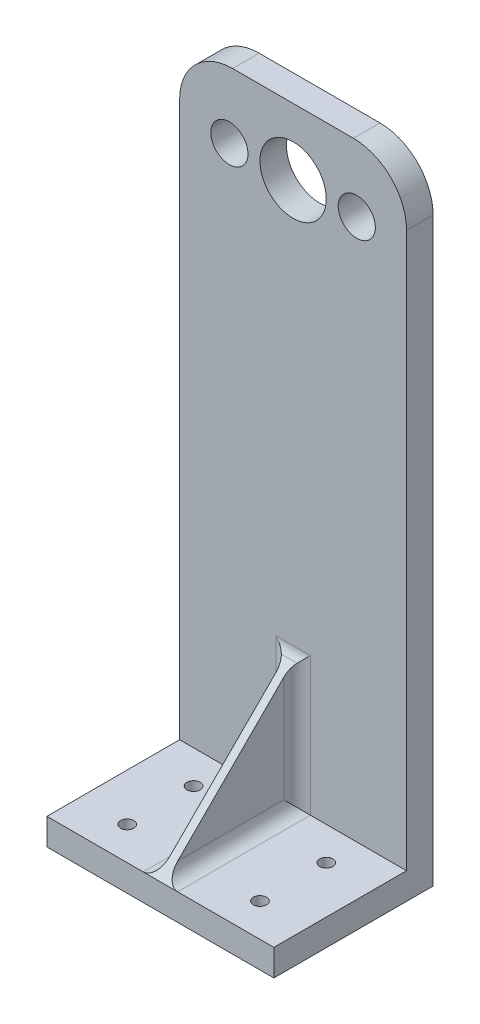
ISO-10303-21;
HEADER;
FILE_DESCRIPTION(('STEP AP214'),'2;1');
FILE_NAME('part.step','',(''),(''),'','','');
FILE_SCHEMA(('AUTOMOTIVE_DESIGN { 1 0 10303 214 1 1 1 1 }'));
ENDSEC;
DATA;
#1=APPLICATION_CONTEXT('core data for automotive mechanical design processes');
#2=APPLICATION_PROTOCOL_DEFINITION('international standard','automotive_design',2000,#1);
#3=PRODUCT_CONTEXT('',#1,'mechanical');
#4=PRODUCT('Part','Part','',(#3));
#5=PRODUCT_RELATED_PRODUCT_CATEGORY('part','',(#4));
#6=PRODUCT_DEFINITION_FORMATION('','',#4);
#7=PRODUCT_DEFINITION_CONTEXT('part definition',#1,'design');
#8=PRODUCT_DEFINITION('design','',#6,#7);
#9=PRODUCT_DEFINITION_SHAPE('','',#8);
#10=(LENGTH_UNIT() NAMED_UNIT(*) SI_UNIT(.MILLI.,.METRE.));
#11=(NAMED_UNIT(*) PLANE_ANGLE_UNIT() SI_UNIT($,.RADIAN.));
#12=(NAMED_UNIT(*) SI_UNIT($,.STERADIAN.) SOLID_ANGLE_UNIT());
#13=UNCERTAINTY_MEASURE_WITH_UNIT(LENGTH_MEASURE(1.E-05),#10,'distance_accuracy_value','');
#14=(GEOMETRIC_REPRESENTATION_CONTEXT(3) GLOBAL_UNCERTAINTY_ASSIGNED_CONTEXT((#13)) GLOBAL_UNIT_ASSIGNED_CONTEXT((#10,
#11,#12)) REPRESENTATION_CONTEXT('',''));
#15=CARTESIAN_POINT('',(0.,0.,0.));
#16=DIRECTION('',(0.,0.,1.));
#17=DIRECTION('',(1.,0.,0.));
#18=AXIS2_PLACEMENT_3D('',#15,#16,#17);
#19=CARTESIAN_POINT('',(-10.8585,-51.816,15.24));
#20=DIRECTION('',(0.,-1.,0.));
#21=DIRECTION('',(0.,0.,-1.));
#22=AXIS2_PLACEMENT_3D('',#19,#20,#21);
#23=PLANE('',#22);
#24=CARTESIAN_POINT('',(-6.34999999999999,-51.816,12.065));
#25=DIRECTION('',(0.,1.,0.));
#26=DIRECTION('',(0.,0.,1.));
#27=AXIS2_PLACEMENT_3D('',#24,#25,#26);
#28=CIRCLE('',#27,0.635000000000001);
#29=CARTESIAN_POINT('',(-6.34999999999999,-51.816,12.7));
#30=VERTEX_POINT('',#29);
#31=EDGE_CURVE('E225',#30,#30,#28,.T.);
#32=ORIENTED_EDGE('',*,*,#31,.F.);
#33=EDGE_LOOP('',(#32));
#34=FACE_BOUND('',#33,.T.);
#35=CARTESIAN_POINT('',(-6.34999999999999,-51.816,5.715));
#36=DIRECTION('',(0.,1.,0.));
#37=DIRECTION('',(0.,0.,1.));
#38=AXIS2_PLACEMENT_3D('',#35,#36,#37);
#39=CIRCLE('',#38,0.635000000000001);
#40=CARTESIAN_POINT('',(-6.34999999999999,-51.816,6.35));
#41=VERTEX_POINT('',#40);
#42=EDGE_CURVE('E248',#41,#41,#39,.T.);
#43=ORIENTED_EDGE('',*,*,#42,.F.);
#44=EDGE_LOOP('',(#43));
#45=FACE_BOUND('',#44,.T.);
#46=DIRECTION('',(-1.,0.,0.));
#47=VECTOR('',#46,1.);
#48=CARTESIAN_POINT('',(-10.8585,-51.816,15.24));
#49=LINE('',#48,#47);
#50=CARTESIAN_POINT('',(-1.651,-51.816,15.24));
#51=VERTEX_POINT('',#50);
#52=CARTESIAN_POINT('',(-10.8585,-51.816,15.24));
#53=VERTEX_POINT('',#52);
#54=EDGE_CURVE('E160',#51,#53,#49,.T.);
#55=ORIENTED_EDGE('',*,*,#54,.F.);
#56=DIRECTION('',(0.,0.,1.));
#57=VECTOR('',#56,1.);
#58=CARTESIAN_POINT('',(-1.65099999999999,-51.816,2.54));
#59=LINE('',#58,#57);
#60=CARTESIAN_POINT('',(-1.651,-51.816,2.54));
#61=VERTEX_POINT('',#60);
#62=EDGE_CURVE('E201',#51,#61,#59,.F.);
#63=ORIENTED_EDGE('',*,*,#62,.T.);
#64=DIRECTION('',(-1.,0.,0.));
#65=VECTOR('',#64,1.);
#66=CARTESIAN_POINT('',(-10.8585,-51.816,2.54));
#67=LINE('',#66,#65);
#68=CARTESIAN_POINT('',(-10.8585,-51.816,2.54));
#69=VERTEX_POINT('',#68);
#70=EDGE_CURVE('E165',#61,#69,#67,.T.);
#71=ORIENTED_EDGE('',*,*,#70,.T.);
#72=DIRECTION('',(0.,0.,-1.));
#73=VECTOR('',#72,1.);
#74=CARTESIAN_POINT('',(-10.8585,-51.816,15.24));
#75=LINE('',#74,#73);
#76=EDGE_CURVE('E173',#53,#69,#75,.T.);
#77=ORIENTED_EDGE('',*,*,#76,.F.);
#78=EDGE_LOOP('',(#55,#63,#71,#77));
#79=FACE_BOUND('',#78,.T.);
#80=ADVANCED_FACE('F33',(#34,#45,#79),#23,.F.);
#81=CARTESIAN_POINT('',(0.,0.,2.54));
#82=DIRECTION('',(0.,0.,1.));
#83=DIRECTION('',(1.,0.,0.));
#84=AXIS2_PLACEMENT_3D('',#81,#82,#83);
#85=PLANE('',#84);
#86=DIRECTION('',(-1.,0.,0.));
#87=VECTOR('',#86,1.);
#88=CARTESIAN_POINT('',(0.381000000000005,-38.5899487757862,2.54));
#89=LINE('',#88,#87);
#90=CARTESIAN_POINT('',(-1.65099999999999,-38.5899487757862,2.54));
#91=VERTEX_POINT('',#90);
#92=CARTESIAN_POINT('',(1.65100000000001,-38.5899487757862,2.54));
#93=VERTEX_POINT('',#92);
#94=EDGE_CURVE('E186',#91,#93,#89,.F.);
#95=ORIENTED_EDGE('',*,*,#94,.T.);
#96=DIRECTION('',(0.,-1.,0.));
#97=VECTOR('',#96,1.);
#98=CARTESIAN_POINT('',(1.65100000000001,-51.816,2.54));
#99=LINE('',#98,#97);
#100=CARTESIAN_POINT('',(1.651,-51.816,2.54));
#101=VERTEX_POINT('',#100);
#102=EDGE_CURVE('E190',#93,#101,#99,.T.);
#103=ORIENTED_EDGE('',*,*,#102,.T.);
#104=CARTESIAN_POINT('',(10.8585,-51.816,2.54));
#105=VERTEX_POINT('',#104);
#106=EDGE_CURVE('E162',#105,#101,#67,.T.);
#107=ORIENTED_EDGE('',*,*,#106,.F.);
#108=DIRECTION('',(0.,1.,0.));
#109=VECTOR('',#108,1.);
#110=CARTESIAN_POINT('',(10.8585,6.35,2.54));
#111=LINE('',#110,#109);
#112=CARTESIAN_POINT('',(10.8585,1.27,2.54));
#113=VERTEX_POINT('',#112);
#114=EDGE_CURVE('E389',#105,#113,#111,.T.);
#115=ORIENTED_EDGE('',*,*,#114,.T.);
#116=CARTESIAN_POINT('',(5.7785,1.27,2.54));
#117=DIRECTION('',(0.,0.,1.));
#118=DIRECTION('',(1.,0.,0.));
#119=AXIS2_PLACEMENT_3D('',#116,#117,#118);
#120=CIRCLE('',#119,5.08);
#121=CARTESIAN_POINT('',(5.77849999999999,6.35,2.54));
#122=VERTEX_POINT('',#121);
#123=EDGE_CURVE('E624',#113,#122,#120,.T.);
#124=ORIENTED_EDGE('',*,*,#123,.T.);
#125=DIRECTION('',(-1.,0.,0.));
#126=VECTOR('',#125,1.);
#127=CARTESIAN_POINT('',(-10.8585,6.35,2.54));
#128=LINE('',#127,#126);
#129=CARTESIAN_POINT('',(-5.7785,6.35,2.54));
#130=VERTEX_POINT('',#129);
#131=EDGE_CURVE('E398',#122,#130,#128,.T.);
#132=ORIENTED_EDGE('',*,*,#131,.T.);
#133=CARTESIAN_POINT('',(-5.7785,1.27,2.54));
#134=DIRECTION('',(0.,0.,1.));
#135=DIRECTION('',(1.,0.,0.));
#136=AXIS2_PLACEMENT_3D('',#133,#134,#135);
#137=CIRCLE('',#136,5.08);
#138=CARTESIAN_POINT('',(-10.8585,1.27,2.54));
#139=VERTEX_POINT('',#138);
#140=EDGE_CURVE('E385',#130,#139,#137,.T.);
#141=ORIENTED_EDGE('',*,*,#140,.T.);
#142=DIRECTION('',(0.,-1.,0.));
#143=VECTOR('',#142,1.);
#144=CARTESIAN_POINT('',(-10.8585,6.35,2.54));
#145=LINE('',#144,#143);
#146=EDGE_CURVE('E386',#139,#69,#145,.T.);
#147=ORIENTED_EDGE('',*,*,#146,.T.);
#148=ORIENTED_EDGE('',*,*,#70,.F.);
#149=DIRECTION('',(0.,-1.,0.));
#150=VECTOR('',#149,1.);
#151=CARTESIAN_POINT('',(-1.651,0.,2.54));
#152=LINE('',#151,#150);
#153=EDGE_CURVE('E188',#61,#91,#152,.F.);
#154=ORIENTED_EDGE('',*,*,#153,.T.);
#155=EDGE_LOOP('',(#95,#103,#107,#115,#124,#132,#141,#147,#148,#154));
#156=FACE_BOUND('',#155,.T.);
#157=CARTESIAN_POINT('',(6.096,0.,2.54));
#158=DIRECTION('',(0.,0.,1.));
#159=DIRECTION('',(1.,0.,0.));
#160=AXIS2_PLACEMENT_3D('',#157,#158,#159);
#161=CIRCLE('',#160,1.778);
#162=CARTESIAN_POINT('',(7.874,0.,2.54));
#163=VERTEX_POINT('',#162);
#164=EDGE_CURVE('E414',#163,#163,#161,.T.);
#165=ORIENTED_EDGE('',*,*,#164,.F.);
#166=EDGE_LOOP('',(#165));
#167=FACE_BOUND('',#166,.T.);
#168=CARTESIAN_POINT('',(0.,0.,2.54));
#169=DIRECTION('',(0.,0.,1.));
#170=DIRECTION('',(1.,0.,0.));
#171=AXIS2_PLACEMENT_3D('',#168,#169,#170);
#172=CIRCLE('',#171,3.175);
#173=CARTESIAN_POINT('',(3.175,0.,2.54));
#174=VERTEX_POINT('',#173);
#175=EDGE_CURVE('E409',#174,#174,#172,.T.);
#176=ORIENTED_EDGE('',*,*,#175,.F.);
#177=EDGE_LOOP('',(#176));
#178=FACE_BOUND('',#177,.T.);
#179=CARTESIAN_POINT('',(-6.096,0.,2.54));
#180=DIRECTION('',(0.,0.,1.));
#181=DIRECTION('',(1.,0.,0.));
#182=AXIS2_PLACEMENT_3D('',#179,#180,#181);
#183=CIRCLE('',#182,1.778);
#184=CARTESIAN_POINT('',(-4.318,0.,2.54));
#185=VERTEX_POINT('',#184);
#186=EDGE_CURVE('E176',#185,#185,#183,.T.);
#187=ORIENTED_EDGE('',*,*,#186,.F.);
#188=EDGE_LOOP('',(#187));
#189=FACE_BOUND('',#188,.T.);
#190=ADVANCED_FACE('F302',(#156,#167,#178,#189),#85,.T.);
#191=CARTESIAN_POINT('',(0.,0.,0.));
#192=DIRECTION('',(0.,0.,1.));
#193=DIRECTION('',(1.,0.,0.));
#194=AXIS2_PLACEMENT_3D('',#191,#192,#193);
#195=PLANE('',#194);
#196=CARTESIAN_POINT('',(6.096,0.,0.));
#197=DIRECTION('',(0.,0.,1.));
#198=DIRECTION('',(1.,0.,0.));
#199=AXIS2_PLACEMENT_3D('',#196,#197,#198);
#200=CIRCLE('',#199,1.778);
#201=CARTESIAN_POINT('',(7.874,0.,0.));
#202=VERTEX_POINT('',#201);
#203=EDGE_CURVE('E416',#202,#202,#200,.T.);
#204=ORIENTED_EDGE('',*,*,#203,.T.);
#205=EDGE_LOOP('',(#204));
#206=FACE_BOUND('',#205,.T.);
#207=DIRECTION('',(-1.,0.,0.));
#208=VECTOR('',#207,1.);
#209=CARTESIAN_POINT('',(-10.8585,6.35,0.));
#210=LINE('',#209,#208);
#211=CARTESIAN_POINT('',(5.77849999999999,6.35,0.));
#212=VERTEX_POINT('',#211);
#213=CARTESIAN_POINT('',(-5.7785,6.35,0.));
#214=VERTEX_POINT('',#213);
#215=EDGE_CURVE('E390',#212,#214,#210,.T.);
#216=ORIENTED_EDGE('',*,*,#215,.F.);
#217=CARTESIAN_POINT('',(5.7785,1.27,0.));
#218=DIRECTION('',(0.,0.,1.));
#219=DIRECTION('',(1.,0.,0.));
#220=AXIS2_PLACEMENT_3D('',#217,#218,#219);
#221=CIRCLE('',#220,5.08);
#222=CARTESIAN_POINT('',(10.8585,1.27,0.));
#223=VERTEX_POINT('',#222);
#224=EDGE_CURVE('E381',#212,#223,#221,.F.);
#225=ORIENTED_EDGE('',*,*,#224,.T.);
#226=DIRECTION('',(0.,1.,0.));
#227=VECTOR('',#226,1.);
#228=CARTESIAN_POINT('',(10.8585,6.35,0.));
#229=LINE('',#228,#227);
#230=CARTESIAN_POINT('',(10.8585,-54.356,0.));
#231=VERTEX_POINT('',#230);
#232=EDGE_CURVE('E405',#231,#223,#229,.T.);
#233=ORIENTED_EDGE('',*,*,#232,.F.);
#234=DIRECTION('',(1.,0.,0.));
#235=VECTOR('',#234,1.);
#236=CARTESIAN_POINT('',(-10.8585,-54.356,0.));
#237=LINE('',#236,#235);
#238=CARTESIAN_POINT('',(-10.8585,-54.356,0.));
#239=VERTEX_POINT('',#238);
#240=EDGE_CURVE('E408',#239,#231,#237,.T.);
#241=ORIENTED_EDGE('',*,*,#240,.F.);
#242=DIRECTION('',(0.,-1.,0.));
#243=VECTOR('',#242,1.);
#244=CARTESIAN_POINT('',(-10.8585,6.35,0.));
#245=LINE('',#244,#243);
#246=CARTESIAN_POINT('',(-10.8585,1.27,0.));
#247=VERTEX_POINT('',#246);
#248=EDGE_CURVE('E146',#247,#239,#245,.T.);
#249=ORIENTED_EDGE('',*,*,#248,.F.);
#250=CARTESIAN_POINT('',(-5.7785,1.27,0.));
#251=DIRECTION('',(0.,0.,1.));
#252=DIRECTION('',(1.,0.,0.));
#253=AXIS2_PLACEMENT_3D('',#250,#251,#252);
#254=CIRCLE('',#253,5.08);
#255=EDGE_CURVE('E379',#247,#214,#254,.F.);
#256=ORIENTED_EDGE('',*,*,#255,.T.);
#257=EDGE_LOOP('',(#216,#225,#233,#241,#249,#256));
#258=FACE_BOUND('',#257,.T.);
#259=CARTESIAN_POINT('',(0.,0.,0.));
#260=DIRECTION('',(0.,0.,1.));
#261=DIRECTION('',(1.,0.,0.));
#262=AXIS2_PLACEMENT_3D('',#259,#260,#261);
#263=CIRCLE('',#262,3.175);
#264=CARTESIAN_POINT('',(3.175,0.,0.));
#265=VERTEX_POINT('',#264);
#266=EDGE_CURVE('E394',#265,#265,#263,.T.);
#267=ORIENTED_EDGE('',*,*,#266,.T.);
#268=EDGE_LOOP('',(#267));
#269=FACE_BOUND('',#268,.T.);
#270=CARTESIAN_POINT('',(-6.096,0.,0.));
#271=DIRECTION('',(0.,0.,1.));
#272=DIRECTION('',(1.,0.,0.));
#273=AXIS2_PLACEMENT_3D('',#270,#271,#272);
#274=CIRCLE('',#273,1.778);
#275=CARTESIAN_POINT('',(-4.318,0.,0.));
#276=VERTEX_POINT('',#275);
#277=EDGE_CURVE('E368',#276,#276,#274,.T.);
#278=ORIENTED_EDGE('',*,*,#277,.T.);
#279=EDGE_LOOP('',(#278));
#280=FACE_BOUND('',#279,.T.);
#281=ADVANCED_FACE('F308',(#206,#258,#269,#280),#195,.F.);
#282=CARTESIAN_POINT('',(-10.8585,6.35,2.54));
#283=DIRECTION('',(1.,0.,0.));
#284=DIRECTION('',(0.,1.,0.));
#285=AXIS2_PLACEMENT_3D('',#282,#283,#284);
#286=PLANE('',#285);
#287=ORIENTED_EDGE('',*,*,#146,.F.);
#288=DIRECTION('',(0.,0.,-1.));
#289=VECTOR('',#288,1.);
#290=CARTESIAN_POINT('',(-10.8585,1.27,2.54));
#291=LINE('',#290,#289);
#292=EDGE_CURVE('E184',#139,#247,#291,.T.);
#293=ORIENTED_EDGE('',*,*,#292,.T.);
#294=ORIENTED_EDGE('',*,*,#248,.T.);
#295=DIRECTION('',(0.,0.,-1.));
#296=VECTOR('',#295,1.);
#297=CARTESIAN_POINT('',(-10.8585,-54.356,2.54));
#298=LINE('',#297,#296);
#299=CARTESIAN_POINT('',(-10.8585,-54.356,15.24));
#300=VERTEX_POINT('',#299);
#301=EDGE_CURVE('E137',#300,#239,#298,.T.);
#302=ORIENTED_EDGE('',*,*,#301,.F.);
#303=DIRECTION('',(0.,-1.,0.));
#304=VECTOR('',#303,1.);
#305=CARTESIAN_POINT('',(-10.8585,-54.356,15.24));
#306=LINE('',#305,#304);
#307=EDGE_CURVE('E143',#53,#300,#306,.T.);
#308=ORIENTED_EDGE('',*,*,#307,.F.);
#309=ORIENTED_EDGE('',*,*,#76,.T.);
#310=EDGE_LOOP('',(#287,#293,#294,#302,#308,#309));
#311=FACE_BOUND('',#310,.T.);
#312=ADVANCED_FACE('F140',(#311),#286,.F.);
#313=CARTESIAN_POINT('',(-10.8585,-54.356,2.54));
#314=DIRECTION('',(0.,1.,0.));
#315=DIRECTION('',(0.,0.,1.));
#316=AXIS2_PLACEMENT_3D('',#313,#314,#315);
#317=PLANE('',#316);
#318=CARTESIAN_POINT('',(-6.34999999999999,-54.356,12.065));
#319=DIRECTION('',(0.,1.,0.));
#320=DIRECTION('',(0.,0.,1.));
#321=AXIS2_PLACEMENT_3D('',#318,#319,#320);
#322=CIRCLE('',#321,0.635000000000001);
#323=CARTESIAN_POINT('',(-6.34999999999999,-54.356,12.7));
#324=VERTEX_POINT('',#323);
#325=EDGE_CURVE('E231',#324,#324,#322,.T.);
#326=ORIENTED_EDGE('',*,*,#325,.T.);
#327=EDGE_LOOP('',(#326));
#328=FACE_BOUND('',#327,.T.);
#329=CARTESIAN_POINT('',(6.35,-54.356,12.065));
#330=DIRECTION('',(0.,1.,0.));
#331=DIRECTION('',(0.,0.,1.));
#332=AXIS2_PLACEMENT_3D('',#329,#330,#331);
#333=CIRCLE('',#332,0.635000000000001);
#334=CARTESIAN_POINT('',(6.35,-54.356,12.7));
#335=VERTEX_POINT('',#334);
#336=EDGE_CURVE('E239',#335,#335,#333,.T.);
#337=ORIENTED_EDGE('',*,*,#336,.T.);
#338=EDGE_LOOP('',(#337));
#339=FACE_BOUND('',#338,.T.);
#340=CARTESIAN_POINT('',(6.35,-54.356,5.715));
#341=DIRECTION('',(0.,1.,0.));
#342=DIRECTION('',(0.,0.,1.));
#343=AXIS2_PLACEMENT_3D('',#340,#341,#342);
#344=CIRCLE('',#343,0.635000000000001);
#345=CARTESIAN_POINT('',(6.35,-54.356,6.35));
#346=VERTEX_POINT('',#345);
#347=EDGE_CURVE('E245',#346,#346,#344,.T.);
#348=ORIENTED_EDGE('',*,*,#347,.T.);
#349=EDGE_LOOP('',(#348));
#350=FACE_BOUND('',#349,.T.);
#351=CARTESIAN_POINT('',(-6.34999999999999,-54.356,5.715));
#352=DIRECTION('',(0.,1.,0.));
#353=DIRECTION('',(0.,0.,1.));
#354=AXIS2_PLACEMENT_3D('',#351,#352,#353);
#355=CIRCLE('',#354,0.635000000000001);
#356=CARTESIAN_POINT('',(-6.34999999999999,-54.356,6.35));
#357=VERTEX_POINT('',#356);
#358=EDGE_CURVE('E251',#357,#357,#355,.T.);
#359=ORIENTED_EDGE('',*,*,#358,.T.);
#360=EDGE_LOOP('',(#359));
#361=FACE_BOUND('',#360,.T.);
#362=ORIENTED_EDGE('',*,*,#240,.T.);
#363=DIRECTION('',(0.,0.,-1.));
#364=VECTOR('',#363,1.);
#365=CARTESIAN_POINT('',(10.8585,-54.356,2.54));
#366=LINE('',#365,#364);
#367=CARTESIAN_POINT('',(10.8585,-54.356,15.24));
#368=VERTEX_POINT('',#367);
#369=EDGE_CURVE('E150',#368,#231,#366,.T.);
#370=ORIENTED_EDGE('',*,*,#369,.F.);
#371=DIRECTION('',(1.,0.,0.));
#372=VECTOR('',#371,1.);
#373=CARTESIAN_POINT('',(-10.8585,-54.356,15.24));
#374=LINE('',#373,#372);
#375=EDGE_CURVE('E153',#300,#368,#374,.T.);
#376=ORIENTED_EDGE('',*,*,#375,.F.);
#377=ORIENTED_EDGE('',*,*,#301,.T.);
#378=EDGE_LOOP('',(#362,#370,#376,#377));
#379=FACE_BOUND('',#378,.T.);
#380=ADVANCED_FACE('F154',(#328,#339,#350,#361,#379),#317,.F.);
#381=CARTESIAN_POINT('',(10.8585,6.35,2.54));
#382=DIRECTION('',(-1.,0.,0.));
#383=DIRECTION('',(0.,-1.,0.));
#384=AXIS2_PLACEMENT_3D('',#381,#382,#383);
#385=PLANE('',#384);
#386=ORIENTED_EDGE('',*,*,#232,.T.);
#387=DIRECTION('',(0.,0.,-1.));
#388=VECTOR('',#387,1.);
#389=CARTESIAN_POINT('',(10.8585,1.27,2.54));
#390=LINE('',#389,#388);
#391=EDGE_CURVE('E383',#223,#113,#390,.F.);
#392=ORIENTED_EDGE('',*,*,#391,.T.);
#393=ORIENTED_EDGE('',*,*,#114,.F.);
#394=DIRECTION('',(0.,0.,-1.));
#395=VECTOR('',#394,1.);
#396=CARTESIAN_POINT('',(10.8585,-51.816,15.24));
#397=LINE('',#396,#395);
#398=CARTESIAN_POINT('',(10.8585,-51.816,15.24));
#399=VERTEX_POINT('',#398);
#400=EDGE_CURVE('E367',#399,#105,#397,.T.);
#401=ORIENTED_EDGE('',*,*,#400,.F.);
#402=DIRECTION('',(0.,1.,0.));
#403=VECTOR('',#402,1.);
#404=CARTESIAN_POINT('',(10.8585,-54.356,15.24));
#405=LINE('',#404,#403);
#406=EDGE_CURVE('E157',#368,#399,#405,.T.);
#407=ORIENTED_EDGE('',*,*,#406,.F.);
#408=ORIENTED_EDGE('',*,*,#369,.T.);
#409=EDGE_LOOP('',(#386,#392,#393,#401,#407,#408));
#410=FACE_BOUND('',#409,.T.);
#411=ADVANCED_FACE('F356',(#410),#385,.F.);
#412=CARTESIAN_POINT('',(-10.8585,6.35,2.54));
#413=DIRECTION('',(0.,-1.,0.));
#414=DIRECTION('',(1.,0.,0.));
#415=AXIS2_PLACEMENT_3D('',#412,#413,#414);
#416=PLANE('',#415);
#417=ORIENTED_EDGE('',*,*,#131,.F.);
#418=DIRECTION('',(0.,0.,-1.));
#419=VECTOR('',#418,1.);
#420=CARTESIAN_POINT('',(5.7785,6.35,2.54));
#421=LINE('',#420,#419);
#422=EDGE_CURVE('E376',#122,#212,#421,.T.);
#423=ORIENTED_EDGE('',*,*,#422,.T.);
#424=ORIENTED_EDGE('',*,*,#215,.T.);
#425=DIRECTION('',(0.,0.,-1.));
#426=VECTOR('',#425,1.);
#427=CARTESIAN_POINT('',(-5.7785,6.35,2.54));
#428=LINE('',#427,#426);
#429=EDGE_CURVE('E149',#214,#130,#428,.F.);
#430=ORIENTED_EDGE('',*,*,#429,.T.);
#431=EDGE_LOOP('',(#417,#423,#424,#430));
#432=FACE_BOUND('',#431,.T.);
#433=ADVANCED_FACE('F437',(#432),#416,.F.);
#434=CARTESIAN_POINT('',(0.,0.,2.54));
#435=DIRECTION('',(0.,0.,-1.));
#436=DIRECTION('',(-1.,0.,0.));
#437=AXIS2_PLACEMENT_3D('',#434,#435,#436);
#438=CYLINDRICAL_SURFACE('',#437,3.175);
#439=ORIENTED_EDGE('',*,*,#175,.T.);
#440=EDGE_LOOP('',(#439));
#441=FACE_BOUND('',#440,.T.);
#442=ORIENTED_EDGE('',*,*,#266,.F.);
#443=EDGE_LOOP('',(#442));
#444=FACE_BOUND('',#443,.T.);
#445=ADVANCED_FACE('F440',(#441,#444),#438,.F.);
#446=CARTESIAN_POINT('',(6.096,0.,2.54));
#447=DIRECTION('',(0.,0.,-1.));
#448=DIRECTION('',(-1.,0.,0.));
#449=AXIS2_PLACEMENT_3D('',#446,#447,#448);
#450=CYLINDRICAL_SURFACE('',#449,1.778);
#451=ORIENTED_EDGE('',*,*,#164,.T.);
#452=EDGE_LOOP('',(#451));
#453=FACE_BOUND('',#452,.T.);
#454=ORIENTED_EDGE('',*,*,#203,.F.);
#455=EDGE_LOOP('',(#454));
#456=FACE_BOUND('',#455,.T.);
#457=ADVANCED_FACE('F321',(#453,#456),#450,.F.);
#458=CARTESIAN_POINT('',(-6.096,0.,2.54));
#459=DIRECTION('',(0.,0.,-1.));
#460=DIRECTION('',(-1.,0.,0.));
#461=AXIS2_PLACEMENT_3D('',#458,#459,#460);
#462=CYLINDRICAL_SURFACE('',#461,1.778);
#463=ORIENTED_EDGE('',*,*,#186,.T.);
#464=EDGE_LOOP('',(#463));
#465=FACE_BOUND('',#464,.T.);
#466=ORIENTED_EDGE('',*,*,#277,.F.);
#467=EDGE_LOOP('',(#466));
#468=FACE_BOUND('',#467,.T.);
#469=ADVANCED_FACE('F315',(#465,#468),#462,.F.);
#470=CARTESIAN_POINT('',(6.35,-51.816,12.065));
#471=DIRECTION('',(0.,1.,0.));
#472=DIRECTION('',(0.,0.,1.));
#473=AXIS2_PLACEMENT_3D('',#470,#471,#472);
#474=CIRCLE('',#473,0.635000000000001);
#475=CARTESIAN_POINT('',(6.35,-51.816,12.7));
#476=VERTEX_POINT('',#475);
#477=EDGE_CURVE('E236',#476,#476,#474,.T.);
#478=ORIENTED_EDGE('',*,*,#477,.F.);
#479=EDGE_LOOP('',(#478));
#480=FACE_BOUND('',#479,.T.);
#481=CARTESIAN_POINT('',(6.35,-51.816,5.715));
#482=DIRECTION('',(0.,1.,0.));
#483=DIRECTION('',(0.,0.,1.));
#484=AXIS2_PLACEMENT_3D('',#481,#482,#483);
#485=CIRCLE('',#484,0.635000000000001);
#486=CARTESIAN_POINT('',(6.35,-51.816,6.35));
#487=VERTEX_POINT('',#486);
#488=EDGE_CURVE('E242',#487,#487,#485,.T.);
#489=ORIENTED_EDGE('',*,*,#488,.F.);
#490=EDGE_LOOP('',(#489));
#491=FACE_BOUND('',#490,.T.);
#492=ORIENTED_EDGE('',*,*,#106,.T.);
#493=DIRECTION('',(0.,0.,1.));
#494=VECTOR('',#493,1.);
#495=CARTESIAN_POINT('',(1.65100000000001,-51.816,15.24));
#496=LINE('',#495,#494);
#497=CARTESIAN_POINT('',(1.65100000000001,-51.816,15.24));
#498=VERTEX_POINT('',#497);
#499=EDGE_CURVE('E203',#101,#498,#496,.T.);
#500=ORIENTED_EDGE('',*,*,#499,.T.);
#501=EDGE_CURVE('E171',#399,#498,#49,.T.);
#502=ORIENTED_EDGE('',*,*,#501,.F.);
#503=ORIENTED_EDGE('',*,*,#400,.T.);
#504=EDGE_LOOP('',(#492,#500,#502,#503));
#505=FACE_BOUND('',#504,.T.);
#506=ADVANCED_FACE('F286',(#480,#491,#505),#23,.F.);
#507=CARTESIAN_POINT('',(0.,0.,15.24));
#508=DIRECTION('',(0.,0.,-1.));
#509=DIRECTION('',(-1.,0.,0.));
#510=AXIS2_PLACEMENT_3D('',#507,#508,#509);
#511=PLANE('',#510);
#512=ORIENTED_EDGE('',*,*,#307,.T.);
#513=ORIENTED_EDGE('',*,*,#375,.T.);
#514=ORIENTED_EDGE('',*,*,#406,.T.);
#515=ORIENTED_EDGE('',*,*,#501,.T.);
#516=DIRECTION('',(-1.,0.,0.));
#517=VECTOR('',#516,1.);
#518=CARTESIAN_POINT('',(0.381000000000007,-51.816,15.24));
#519=LINE('',#518,#517);
#520=EDGE_CURVE('E51',#498,#51,#519,.T.);
#521=ORIENTED_EDGE('',*,*,#520,.T.);
#522=ORIENTED_EDGE('',*,*,#54,.T.);
#523=EDGE_LOOP('',(#512,#513,#514,#515,#521,#522));
#524=FACE_BOUND('',#523,.T.);
#525=ADVANCED_FACE('F159',(#524),#511,.F.);
#526=CARTESIAN_POINT('',(0.381000000000005,-39.116,2.54));
#527=DIRECTION('',(0.,0.707106781186547,0.707106781186548));
#528=DIRECTION('',(0.,-0.707106781186548,0.707106781186547));
#529=AXIS2_PLACEMENT_3D('',#526,#527,#528);
#530=PLANE('',#529);
#531=CARTESIAN_POINT('',(1.65100000000001,-40.386,3.81));
#532=DIRECTION('',(0.,0.707106781186547,0.707106781186548));
#533=DIRECTION('',(0.,0.707106781186548,-0.707106781186547));
#534=AXIS2_PLACEMENT_3D('',#531,#532,#533);
#535=ELLIPSE('',#534,1.79605122421383,1.27);
#536=CARTESIAN_POINT('',(0.381000000000006,-40.386,3.81));
#537=VERTEX_POINT('',#536);
#538=CARTESIAN_POINT('',(0.752974387893092,-39.4879743878931,2.91197438789308));
#539=VERTEX_POINT('',#538);
#540=EDGE_CURVE('E208',#537,#539,#535,.F.);
#541=ORIENTED_EDGE('',*,*,#540,.T.);
#542=DIRECTION('',(-1.,0.,0.));
#543=VECTOR('',#542,1.);
#544=CARTESIAN_POINT('',(-0.380999999999995,-39.4879743878931,2.91197438789308));
#545=LINE('',#544,#543);
#546=CARTESIAN_POINT('',(-0.752974387893081,-39.4879743878931,2.91197438789308));
#547=VERTEX_POINT('',#546);
#548=EDGE_CURVE('E206',#539,#547,#545,.T.);
#549=ORIENTED_EDGE('',*,*,#548,.T.);
#550=CARTESIAN_POINT('',(-1.65099999999999,-40.386,3.81));
#551=DIRECTION('',(0.,0.707106781186547,0.707106781186548));
#552=DIRECTION('',(0.,-0.707106781186548,0.707106781186547));
#553=AXIS2_PLACEMENT_3D('',#550,#551,#552);
#554=ELLIPSE('',#553,1.79605122421383,1.27);
#555=CARTESIAN_POINT('',(-0.380999999999994,-40.386,3.81));
#556=VERTEX_POINT('',#555);
#557=EDGE_CURVE('E211',#547,#556,#554,.F.);
#558=ORIENTED_EDGE('',*,*,#557,.T.);
#559=DIRECTION('',(0.,0.707106781186548,-0.707106781186547));
#560=VECTOR('',#559,1.);
#561=CARTESIAN_POINT('',(-0.380999999999995,-39.116,2.54));
#562=LINE('',#561,#560);
#563=CARTESIAN_POINT('',(-0.380999999999993,-50.546,13.97));
#564=VERTEX_POINT('',#563);
#565=EDGE_CURVE('E254',#564,#556,#562,.T.);
#566=ORIENTED_EDGE('',*,*,#565,.F.);
#567=CARTESIAN_POINT('',(-1.65099999999999,-50.546,13.97));
#568=DIRECTION('',(0.,0.707106781186547,0.707106781186548));
#569=DIRECTION('',(0.,0.707106781186548,-0.707106781186547));
#570=AXIS2_PLACEMENT_3D('',#567,#568,#569);
#571=ELLIPSE('',#570,1.79605122421383,1.27);
#572=EDGE_CURVE('E43',#564,#51,#571,.F.);
#573=ORIENTED_EDGE('',*,*,#572,.T.);
#574=ORIENTED_EDGE('',*,*,#520,.F.);
#575=CARTESIAN_POINT('',(1.65100000000001,-50.546,13.97));
#576=DIRECTION('',(0.,0.707106781186547,0.707106781186548));
#577=DIRECTION('',(0.,-0.707106781186548,0.707106781186547));
#578=AXIS2_PLACEMENT_3D('',#575,#576,#577);
#579=ELLIPSE('',#578,1.79605122421383,1.27);
#580=CARTESIAN_POINT('',(0.381000000000007,-50.546,13.97));
#581=VERTEX_POINT('',#580);
#582=EDGE_CURVE('E11',#498,#581,#579,.F.);
#583=ORIENTED_EDGE('',*,*,#582,.T.);
#584=DIRECTION('',(0.,0.707106781186548,-0.707106781186547));
#585=VECTOR('',#584,1.);
#586=CARTESIAN_POINT('',(0.381000000000005,-39.116,2.54));
#587=LINE('',#586,#585);
#588=EDGE_CURVE('E258',#581,#537,#587,.T.);
#589=ORIENTED_EDGE('',*,*,#588,.T.);
#590=EDGE_LOOP('',(#541,#549,#558,#566,#573,#574,#583,#589));
#591=FACE_BOUND('',#590,.T.);
#592=ADVANCED_FACE('F263',(#591),#530,.T.);
#593=CARTESIAN_POINT('',(0.381,0.,0.));
#594=DIRECTION('',(1.,0.,0.));
#595=DIRECTION('',(0.,1.,0.));
#596=AXIS2_PLACEMENT_3D('',#593,#594,#595);
#597=PLANE('',#596);
#598=DIRECTION('',(0.,0.,1.));
#599=VECTOR('',#598,1.);
#600=CARTESIAN_POINT('',(0.381000000000007,-50.546,0.));
#601=LINE('',#600,#599);
#602=CARTESIAN_POINT('',(0.381000000000007,-50.546,3.81));
#603=VERTEX_POINT('',#602);
#604=EDGE_CURVE('E193',#581,#603,#601,.F.);
#605=ORIENTED_EDGE('',*,*,#604,.T.);
#606=DIRECTION('',(0.,-1.,0.));
#607=VECTOR('',#606,1.);
#608=CARTESIAN_POINT('',(0.381000000000005,-39.116,3.81));
#609=LINE('',#608,#607);
#610=EDGE_CURVE('E195',#603,#537,#609,.F.);
#611=ORIENTED_EDGE('',*,*,#610,.T.);
#612=ORIENTED_EDGE('',*,*,#588,.F.);
#613=EDGE_LOOP('',(#605,#611,#612));
#614=FACE_BOUND('',#613,.T.);
#615=ADVANCED_FACE('F291',(#614),#597,.T.);
#616=CARTESIAN_POINT('',(-0.381,0.,0.));
#617=DIRECTION('',(1.,0.,0.));
#618=DIRECTION('',(0.,1.,0.));
#619=AXIS2_PLACEMENT_3D('',#616,#617,#618);
#620=PLANE('',#619);
#621=ORIENTED_EDGE('',*,*,#565,.T.);
#622=DIRECTION('',(0.,-1.,0.));
#623=VECTOR('',#622,1.);
#624=CARTESIAN_POINT('',(-0.381,0.,3.81));
#625=LINE('',#624,#623);
#626=CARTESIAN_POINT('',(-0.380999999999993,-50.546,3.81));
#627=VERTEX_POINT('',#626);
#628=EDGE_CURVE('E199',#556,#627,#625,.T.);
#629=ORIENTED_EDGE('',*,*,#628,.T.);
#630=DIRECTION('',(0.,0.,1.));
#631=VECTOR('',#630,1.);
#632=CARTESIAN_POINT('',(-0.380999999999993,-50.546,15.24));
#633=LINE('',#632,#631);
#634=EDGE_CURVE('E197',#627,#564,#633,.T.);
#635=ORIENTED_EDGE('',*,*,#634,.T.);
#636=EDGE_LOOP('',(#621,#629,#635));
#637=FACE_BOUND('',#636,.T.);
#638=ADVANCED_FACE('F279',(#637),#620,.F.);
#639=CARTESIAN_POINT('',(-6.34999999999999,-54.356,5.715));
#640=DIRECTION('',(0.,1.,0.));
#641=DIRECTION('',(0.,0.,1.));
#642=AXIS2_PLACEMENT_3D('',#639,#640,#641);
#643=CYLINDRICAL_SURFACE('',#642,0.635000000000001);
#644=ORIENTED_EDGE('',*,*,#358,.F.);
#645=EDGE_LOOP('',(#644));
#646=FACE_BOUND('',#645,.T.);
#647=ORIENTED_EDGE('',*,*,#42,.T.);
#648=EDGE_LOOP('',(#647));
#649=FACE_BOUND('',#648,.T.);
#650=ADVANCED_FACE('F298',(#646,#649),#643,.F.);
#651=CARTESIAN_POINT('',(6.35,-54.356,5.715));
#652=DIRECTION('',(0.,1.,0.));
#653=DIRECTION('',(0.,0.,1.));
#654=AXIS2_PLACEMENT_3D('',#651,#652,#653);
#655=CYLINDRICAL_SURFACE('',#654,0.635000000000001);
#656=ORIENTED_EDGE('',*,*,#347,.F.);
#657=EDGE_LOOP('',(#656));
#658=FACE_BOUND('',#657,.T.);
#659=ORIENTED_EDGE('',*,*,#488,.T.);
#660=EDGE_LOOP('',(#659));
#661=FACE_BOUND('',#660,.T.);
#662=ADVANCED_FACE('F327',(#658,#661),#655,.F.);
#663=CARTESIAN_POINT('',(6.35,-54.356,12.065));
#664=DIRECTION('',(0.,1.,0.));
#665=DIRECTION('',(0.,0.,1.));
#666=AXIS2_PLACEMENT_3D('',#663,#664,#665);
#667=CYLINDRICAL_SURFACE('',#666,0.635000000000001);
#668=ORIENTED_EDGE('',*,*,#336,.F.);
#669=EDGE_LOOP('',(#668));
#670=FACE_BOUND('',#669,.T.);
#671=ORIENTED_EDGE('',*,*,#477,.T.);
#672=EDGE_LOOP('',(#671));
#673=FACE_BOUND('',#672,.T.);
#674=ADVANCED_FACE('F329',(#670,#673),#667,.F.);
#675=CARTESIAN_POINT('',(-6.34999999999999,-54.356,12.065));
#676=DIRECTION('',(0.,1.,0.));
#677=DIRECTION('',(0.,0.,1.));
#678=AXIS2_PLACEMENT_3D('',#675,#676,#677);
#679=CYLINDRICAL_SURFACE('',#678,0.635000000000001);
#680=ORIENTED_EDGE('',*,*,#325,.F.);
#681=EDGE_LOOP('',(#680));
#682=FACE_BOUND('',#681,.T.);
#683=ORIENTED_EDGE('',*,*,#31,.T.);
#684=EDGE_LOOP('',(#683));
#685=FACE_BOUND('',#684,.T.);
#686=ADVANCED_FACE('F336',(#682,#685),#679,.F.);
#687=CARTESIAN_POINT('',(5.7785,1.27,2.54));
#688=DIRECTION('',(0.,0.,-1.));
#689=DIRECTION('',(-1.,0.,0.));
#690=AXIS2_PLACEMENT_3D('',#687,#688,#689);
#691=CYLINDRICAL_SURFACE('',#690,5.08);
#692=ORIENTED_EDGE('',*,*,#123,.F.);
#693=ORIENTED_EDGE('',*,*,#391,.F.);
#694=ORIENTED_EDGE('',*,*,#224,.F.);
#695=ORIENTED_EDGE('',*,*,#422,.F.);
#696=EDGE_LOOP('',(#692,#693,#694,#695));
#697=FACE_BOUND('',#696,.T.);
#698=ADVANCED_FACE('F344',(#697),#691,.T.);
#699=CARTESIAN_POINT('',(-5.7785,1.27,2.54));
#700=DIRECTION('',(0.,0.,-1.));
#701=DIRECTION('',(-1.,0.,0.));
#702=AXIS2_PLACEMENT_3D('',#699,#700,#701);
#703=CYLINDRICAL_SURFACE('',#702,5.08);
#704=ORIENTED_EDGE('',*,*,#140,.F.);
#705=ORIENTED_EDGE('',*,*,#429,.F.);
#706=ORIENTED_EDGE('',*,*,#255,.F.);
#707=ORIENTED_EDGE('',*,*,#292,.F.);
#708=EDGE_LOOP('',(#704,#705,#706,#707));
#709=FACE_BOUND('',#708,.T.);
#710=ADVANCED_FACE('F349',(#709),#703,.T.);
#711=CARTESIAN_POINT('',(-1.65099999999999,-50.546,0.));
#712=DIRECTION('',(0.,0.,-1.));
#713=DIRECTION('',(-1.,0.,0.));
#714=AXIS2_PLACEMENT_3D('',#711,#712,#713);
#715=CYLINDRICAL_SURFACE('',#714,1.27);
#716=ORIENTED_EDGE('',*,*,#572,.F.);
#717=ORIENTED_EDGE('',*,*,#634,.F.);
#718=CARTESIAN_POINT('',(-1.65099999999999,-50.546,3.81));
#719=DIRECTION('',(0.,-0.707106781186547,0.707106781186547));
#720=DIRECTION('',(0.,-0.707106781186547,-0.707106781186547));
#721=AXIS2_PLACEMENT_3D('',#718,#719,#720);
#722=ELLIPSE('',#721,1.79605122421383,1.27);
#723=EDGE_CURVE('E37',#61,#627,#722,.T.);
#724=ORIENTED_EDGE('',*,*,#723,.F.);
#725=ORIENTED_EDGE('',*,*,#62,.F.);
#726=EDGE_LOOP('',(#716,#717,#724,#725));
#727=FACE_BOUND('',#726,.T.);
#728=ADVANCED_FACE('F35',(#727),#715,.F.);
#729=CARTESIAN_POINT('',(-1.651,0.,3.81));
#730=DIRECTION('',(0.,-1.,0.));
#731=DIRECTION('',(1.,0.,0.));
#732=AXIS2_PLACEMENT_3D('',#729,#730,#731);
#733=CYLINDRICAL_SURFACE('',#732,1.27);
#734=ORIENTED_EDGE('',*,*,#628,.F.);
#735=ORIENTED_EDGE('',*,*,#557,.F.);
#736=CARTESIAN_POINT('',(-1.65099999999999,-38.5899487757862,3.81));
#737=DIRECTION('',(0.707106781186547,0.707106781186548,0.));
#738=DIRECTION('',(0.707106781186548,-0.707106781186547,0.));
#739=AXIS2_PLACEMENT_3D('',#736,#737,#738);
#740=ELLIPSE('',#739,1.79605122421383,1.27);
#741=EDGE_CURVE('E219',#91,#547,#740,.F.);
#742=ORIENTED_EDGE('',*,*,#741,.F.);
#743=ORIENTED_EDGE('',*,*,#153,.F.);
#744=ORIENTED_EDGE('',*,*,#723,.T.);
#745=EDGE_LOOP('',(#734,#735,#742,#743,#744));
#746=FACE_BOUND('',#745,.T.);
#747=ADVANCED_FACE('F276',(#746),#733,.F.);
#748=CARTESIAN_POINT('',(0.381000000000005,-38.5899487757862,3.81));
#749=DIRECTION('',(1.,0.,0.));
#750=DIRECTION('',(0.,1.,0.));
#751=AXIS2_PLACEMENT_3D('',#748,#749,#750);
#752=CYLINDRICAL_SURFACE('',#751,1.27);
#753=ORIENTED_EDGE('',*,*,#548,.F.);
#754=CARTESIAN_POINT('',(1.65100000000001,-38.5899487757862,3.81));
#755=DIRECTION('',(0.707106781186548,-0.707106781186547,0.));
#756=DIRECTION('',(0.707106781186547,0.707106781186548,0.));
#757=AXIS2_PLACEMENT_3D('',#754,#755,#756);
#758=ELLIPSE('',#757,1.79605122421383,1.27);
#759=EDGE_CURVE('E217',#93,#539,#758,.F.);
#760=ORIENTED_EDGE('',*,*,#759,.F.);
#761=ORIENTED_EDGE('',*,*,#94,.F.);
#762=ORIENTED_EDGE('',*,*,#741,.T.);
#763=EDGE_LOOP('',(#753,#760,#761,#762));
#764=FACE_BOUND('',#763,.T.);
#765=ADVANCED_FACE('F273',(#764),#752,.F.);
#766=CARTESIAN_POINT('',(1.65100000000001,-50.546,15.24));
#767=DIRECTION('',(0.,0.,1.));
#768=DIRECTION('',(1.,0.,0.));
#769=AXIS2_PLACEMENT_3D('',#766,#767,#768);
#770=CYLINDRICAL_SURFACE('',#769,1.27);
#771=ORIENTED_EDGE('',*,*,#582,.F.);
#772=ORIENTED_EDGE('',*,*,#499,.F.);
#773=CARTESIAN_POINT('',(1.65100000000001,-50.546,3.81));
#774=DIRECTION('',(0.,0.707106781186547,-0.707106781186547));
#775=DIRECTION('',(0.,0.707106781186547,0.707106781186547));
#776=AXIS2_PLACEMENT_3D('',#773,#774,#775);
#777=ELLIPSE('',#776,1.79605122421383,1.27);
#778=EDGE_CURVE('E215',#603,#101,#777,.F.);
#779=ORIENTED_EDGE('',*,*,#778,.F.);
#780=ORIENTED_EDGE('',*,*,#604,.F.);
#781=EDGE_LOOP('',(#771,#772,#779,#780));
#782=FACE_BOUND('',#781,.T.);
#783=ADVANCED_FACE('F290',(#782),#770,.F.);
#784=CARTESIAN_POINT('',(1.651,0.,3.81));
#785=DIRECTION('',(0.,1.,0.));
#786=DIRECTION('',(-1.,0.,0.));
#787=AXIS2_PLACEMENT_3D('',#784,#785,#786);
#788=CYLINDRICAL_SURFACE('',#787,1.27);
#789=ORIENTED_EDGE('',*,*,#540,.F.);
#790=ORIENTED_EDGE('',*,*,#610,.F.);
#791=ORIENTED_EDGE('',*,*,#778,.T.);
#792=ORIENTED_EDGE('',*,*,#102,.F.);
#793=ORIENTED_EDGE('',*,*,#759,.T.);
#794=EDGE_LOOP('',(#789,#790,#791,#792,#793));
#795=FACE_BOUND('',#794,.T.);
#796=ADVANCED_FACE('F269',(#795),#788,.F.);
#797=CLOSED_SHELL('',(#80,#190,#281,#312,#380,#411,#433,#445,#457,#469,#506,#525,#592,#615,#638,
#650,#662,#674,#686,#698,#710,#728,#747,#765,#783,#796));
#798=MANIFOLD_SOLID_BREP('B2',#797);
#799=ADVANCED_BREP_SHAPE_REPRESENTATION('',(#18,#798),#14);
#800=SHAPE_DEFINITION_REPRESENTATION(#9,#799);
ENDSEC;
END-ISO-10303-21;
